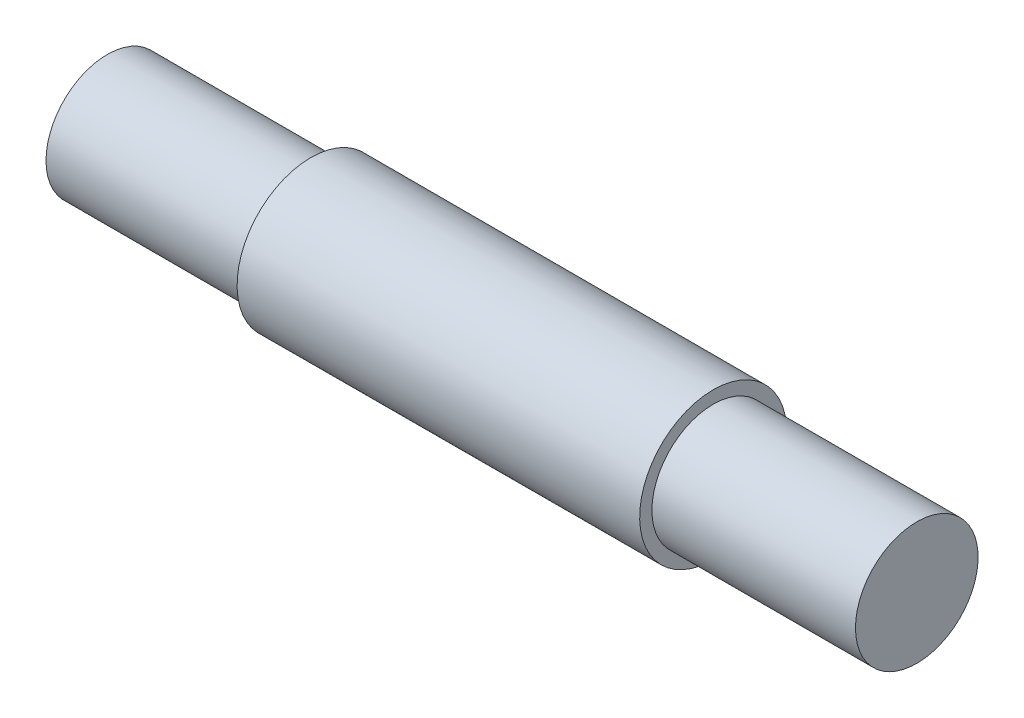
ISO-10303-21;
HEADER;
FILE_DESCRIPTION(('STEP AP214'),'2;1');
FILE_NAME('part.step','',(''),(''),'','','');
FILE_SCHEMA(('AUTOMOTIVE_DESIGN { 1 0 10303 214 1 1 1 1 }'));
ENDSEC;
DATA;
#1=APPLICATION_CONTEXT('core data for automotive mechanical design processes');
#2=APPLICATION_PROTOCOL_DEFINITION('international standard','automotive_design',2000,#1);
#3=PRODUCT_CONTEXT('',#1,'mechanical');
#4=PRODUCT('Part','Part','',(#3));
#5=PRODUCT_RELATED_PRODUCT_CATEGORY('part','',(#4));
#6=PRODUCT_DEFINITION_FORMATION('','',#4);
#7=PRODUCT_DEFINITION_CONTEXT('part definition',#1,'design');
#8=PRODUCT_DEFINITION('design','',#6,#7);
#9=PRODUCT_DEFINITION_SHAPE('','',#8);
#10=(LENGTH_UNIT() NAMED_UNIT(*) SI_UNIT(.MILLI.,.METRE.));
#11=(NAMED_UNIT(*) PLANE_ANGLE_UNIT() SI_UNIT($,.RADIAN.));
#12=(NAMED_UNIT(*) SI_UNIT($,.STERADIAN.) SOLID_ANGLE_UNIT());
#13=UNCERTAINTY_MEASURE_WITH_UNIT(LENGTH_MEASURE(1.E-05),#10,'distance_accuracy_value','');
#14=(GEOMETRIC_REPRESENTATION_CONTEXT(3) GLOBAL_UNCERTAINTY_ASSIGNED_CONTEXT((#13)) GLOBAL_UNIT_ASSIGNED_CONTEXT((#10,
#11,#12)) REPRESENTATION_CONTEXT('',''));
#15=CARTESIAN_POINT('',(0.,0.,0.));
#16=DIRECTION('',(0.,0.,1.));
#17=DIRECTION('',(1.,0.,0.));
#18=AXIS2_PLACEMENT_3D('',#15,#16,#17);
#19=CARTESIAN_POINT('',(-165.,0.,0.));
#20=DIRECTION('',(-1.,0.,0.));
#21=DIRECTION('',(0.,0.,1.));
#22=AXIS2_PLACEMENT_3D('',#19,#20,#21);
#23=CYLINDRICAL_SURFACE('',#22,25.0000000000001);
#24=CARTESIAN_POINT('',(-81.9668927687355,-20.3433340438726,-14.5309586737909));
#25=CARTESIAN_POINT('',(-81.9665946822235,-20.7515901630839,-13.9594090047073));
#26=CARTESIAN_POINT('',(-81.9663142309977,-21.1356931764125,-13.3707087364633));
#27=CARTESIAN_POINT('',(-81.9657904190882,-21.8531003836312,-12.1628697088407));
#28=CARTESIAN_POINT('',(-81.965547068183,-22.1863911851551,-11.5437229814865));
#29=CARTESIAN_POINT('',(-81.9650990529386,-22.799988074823,-10.278872688707));
#30=CARTESIAN_POINT('',(-81.9648944317667,-23.080235041539,-9.63314045597345));
#31=CARTESIAN_POINT('',(-81.9645256722576,-23.5852841144379,-8.32039184013641));
#32=CARTESIAN_POINT('',(-81.9643615312327,-23.8100899014676,-7.65337687335723));
#33=CARTESIAN_POINT('',(-81.9640749494874,-24.2025891838058,-6.30307852014905));
#34=CARTESIAN_POINT('',(-81.9639524899164,-24.3703084965701,-5.61980263773671));
#35=CARTESIAN_POINT('',(-81.9637500370846,-24.6475857190884,-4.24153837972109));
#36=CARTESIAN_POINT('',(-81.9636700444943,-24.7571427103511,-3.54654981933164));
#37=CARTESIAN_POINT('',(-81.9635531124884,-24.9172915277384,-2.14999151356718));
#38=CARTESIAN_POINT('',(-81.963516162105,-24.9678983751292,-1.44842349067625));
#39=CARTESIAN_POINT('',(-81.9634855402824,-25.0098376938008,-0.0435206853568295));
#40=CARTESIAN_POINT('',(-81.9634918686738,-25.0011703969817,0.659814090148775));
#41=CARTESIAN_POINT('',(-81.9635477620209,-24.9246194704131,2.06332860209428));
#42=CARTESIAN_POINT('',(-81.9635973315651,-24.8567295559938,2.76350799576011));
#43=CARTESIAN_POINT('',(-81.9637393611001,-24.6622074325576,4.15565954982598));
#44=CARTESIAN_POINT('',(-81.9638318211342,-24.5355751640176,4.84763170190896));
#45=CARTESIAN_POINT('',(-81.9640589787807,-24.2244624920265,6.21847546285011));
#46=CARTESIAN_POINT('',(-81.964193678037,-24.0399798371248,6.89734656074305));
#47=CARTESIAN_POINT('',(-81.9645043552909,-23.6144796032949,8.23713378849323));
#48=CARTESIAN_POINT('',(-81.9646803332804,-23.373462035432,8.89804992186468));
#49=CARTESIAN_POINT('',(-81.9650723132242,-22.8366105014264,10.1972164061673));
#50=CARTESIAN_POINT('',(-81.9652883144361,-22.5407775520909,10.8354671772719));
#51=CARTESIAN_POINT('',(-81.9657588073368,-21.8963955007615,12.0847782636231));
#52=CARTESIAN_POINT('',(-81.9660132990263,-21.547846397797,12.6958385783691));
#53=CARTESIAN_POINT('',(-81.9665589630347,-20.8005107838025,13.8864232520264));
#54=CARTESIAN_POINT('',(-81.9668501352793,-20.4017243743827,14.465947674719));
#55=CARTESIAN_POINT('',(-81.9674670907413,-19.5567487231352,15.5893418383594));
#56=CARTESIAN_POINT('',(-81.9677928739587,-19.110559481355,16.133211579343));
#57=CARTESIAN_POINT('',(-81.9684767359593,-18.1739493186061,17.1814309002882));
#58=CARTESIAN_POINT('',(-81.9688348148098,-17.6835283052205,17.6857803976729));
#59=CARTESIAN_POINT('',(-81.9695807217617,-16.661942001264,18.6513723447534));
#60=CARTESIAN_POINT('',(-81.9699685498631,-16.1307767107011,19.1126147944577));
#61=CARTESIAN_POINT('',(-81.9707711973582,-15.0314791192235,19.9887126969505));
#62=CARTESIAN_POINT('',(-81.9711860167032,-14.4633468849777,20.4035682333932));
#63=CARTESIAN_POINT('',(-81.9720396981981,-13.2941536201969,21.1839439031275));
#64=CARTESIAN_POINT('',(-81.9724785603478,-12.6930925896961,21.5494640364703));
#65=CARTESIAN_POINT('',(-81.9733772076934,-11.462314517812,22.228570495365));
#66=CARTESIAN_POINT('',(-81.9738369929025,-10.8325974583346,22.5421567881239));
#67=CARTESIAN_POINT('',(-81.9747742173134,-9.54898458680083,23.1151658812731));
#68=CARTESIAN_POINT('',(-81.9752516565152,-8.89508877470856,23.3745886815828));
#69=CARTESIAN_POINT('',(-81.97622079512,-7.56776649741202,23.8374266989243));
#70=CARTESIAN_POINT('',(-81.976712494538,-6.89434001155145,24.0408418567181));
#71=CARTESIAN_POINT('',(-81.9777066574002,-5.53274470988136,24.390218066913));
#72=CARTESIAN_POINT('',(-81.9782091208443,-4.84457589406246,24.5361791192776));
#73=CARTESIAN_POINT('',(-81.9792212394895,-3.45838847441234,24.7696094120487));
#74=CARTESIAN_POINT('',(-81.9797308946898,-2.76036987158979,24.8570786584451));
#75=CARTESIAN_POINT('',(-81.9807537735526,-1.35944530458993,24.9729035100661));
#76=CARTESIAN_POINT('',(-81.9812669972152,-0.656539340415398,25.0012591153244));
#77=CARTESIAN_POINT('',(-81.9822933640812,0.749162423748123,24.9986550942466));
#78=CARTESIAN_POINT('',(-81.9828065072848,1.45195822378155,24.9676954918984));
#79=CARTESIAN_POINT('',(-81.9838290653024,2.85244349014978,24.8466812068532));
#80=CARTESIAN_POINT('',(-81.9843384801164,3.55013295648508,24.7566265241618));
#81=CARTESIAN_POINT('',(-81.9853499598393,4.93544556261455,24.5180622845584));
#82=CARTESIAN_POINT('',(-81.9858520247464,5.62306870010743,24.369552714283));
#83=CARTESIAN_POINT('',(-81.9868452351571,6.98335989710563,24.0151345123943));
#84=CARTESIAN_POINT('',(-81.9873363806607,7.65602795660585,23.8092258807614));
#85=CARTESIAN_POINT('',(-81.9883042605783,8.98162681667661,23.3414734103954));
#86=CARTESIAN_POINT('',(-81.9887809949905,9.63455761466657,23.079629564349));
#87=CARTESIAN_POINT('',(-81.9897166633622,10.9160399103661,22.5018682320611));
#88=CARTESIAN_POINT('',(-81.9901755973218,11.5445914080771,22.1859507458229));
#89=CARTESIAN_POINT('',(-81.9910724019873,12.7728463992842,21.5022881576296));
#90=CARTESIAN_POINT('',(-81.9915102726959,13.3725498963473,21.134543062083));
#91=CARTESIAN_POINT('',(-81.9923618379219,14.5388454336315,20.3498396708643));
#92=CARTESIAN_POINT('',(-81.9927755324393,15.1054374738559,19.9328813751971));
#93=CARTESIAN_POINT('',(-81.9935758041445,16.2014819384111,19.0527159257785));
#94=CARTESIAN_POINT('',(-81.9939623813335,16.7309343644426,18.5895087741448));
#95=CARTESIAN_POINT('',(-81.9947056700699,17.7489355351431,17.6201387207932));
#96=CARTESIAN_POINT('',(-81.9950623816174,18.2374842798201,17.1139758190837));
#97=CARTESIAN_POINT('',(-81.9957434029908,19.1702046924794,16.0622928944369));
#98=CARTESIAN_POINT('',(-81.9960677128237,19.6143763701154,15.5167728800614));
#99=CARTESIAN_POINT('',(-81.9966816252074,20.4551849710287,14.390253951911));
#100=CARTESIAN_POINT('',(-81.9969712277583,20.8518218943105,13.8092550381394));
#101=CARTESIAN_POINT('',(-81.9975136666887,21.5947411476786,12.6159088387879));
#102=CARTESIAN_POINT('',(-81.9977665030667,21.9410234755491,12.0035615518286));
#103=CARTESIAN_POINT('',(-81.9982336121204,22.5807716528249,10.7518720530737));
#104=CARTESIAN_POINT('',(-81.998447884796,22.8742375022349,10.1125298412806));
#105=CARTESIAN_POINT('',(-81.9988363430515,23.4062662943833,8.81139597582269));
#106=CARTESIAN_POINT('',(-81.9990105286401,23.6448292489856,8.14960432700909));
#107=CARTESIAN_POINT('',(-81.9993175744254,24.065356289987,6.8082763997795));
#108=CARTESIAN_POINT('',(-81.9994504346221,24.2473203763976,6.12874012136717));
#109=CARTESIAN_POINT('',(-81.999673885052,24.5533560026719,4.75675412305472));
#110=CARTESIAN_POINT('',(-81.9997644752908,24.677427550163,4.06430440485597));
#111=CARTESIAN_POINT('',(-81.9999027417883,24.8667960580292,2.67141434383509));
#112=CARTESIAN_POINT('',(-81.999950418047,24.9320930184244,1.97097400101569));
#113=CARTESIAN_POINT('',(-82.0000025176263,25.0034481174478,0.567082631063027));
#114=CARTESIAN_POINT('',(-82.0000069409608,25.0095062752762,-0.136368395094363));
#115=CARTESIAN_POINT('',(-81.9999725032809,24.9623407492719,-1.54128024368301));
#116=CARTESIAN_POINT('',(-81.9999336422665,24.9091170654408,-2.24274106611432));
#117=CARTESIAN_POINT('',(-81.9998129121427,24.7437662115574,-3.6386858254493));
#118=CARTESIAN_POINT('',(-81.9997310430159,24.6316390176706,-4.33316975952975));
#119=CARTESIAN_POINT('',(-81.9995248786975,24.3492782881632,-5.7102230874667));
#120=CARTESIAN_POINT('',(-81.999400583506,24.1790447524988,-6.3927924813142));
#121=CARTESIAN_POINT('',(-81.9991104506803,23.7816815419442,-7.74116426510128));
#122=CARTESIAN_POINT('',(-81.9989446130339,23.554551850384,-8.40696665012826));
#123=CARTESIAN_POINT('',(-81.9985725743242,23.0450111127997,-9.71707074887029));
#124=CARTESIAN_POINT('',(-81.9983663732608,22.7626000668071,-10.3613724625975));
#125=CARTESIAN_POINT('',(-81.9979150739226,22.1445047249286,-11.6238939498));
#126=CARTESIAN_POINT('',(-81.9976699756889,21.8088204853171,-12.2421137508255));
#127=CARTESIAN_POINT('',(-81.9971426243529,21.0865650558344,-13.4480769700701));
#128=CARTESIAN_POINT('',(-81.9968603712506,20.6999938660241,-14.0358203883255));
#129=CARTESIAN_POINT('',(-81.9962607168958,19.8787129222993,-15.1766522113588));
#130=CARTESIAN_POINT('',(-81.9959433156516,19.4440031798555,-15.7297406243943));
#131=CARTESIAN_POINT('',(-81.9952756214851,18.5295355778994,-16.7973304735898));
#132=CARTESIAN_POINT('',(-81.9949253285629,18.0497777183297,-17.3118319097006));
#133=CARTESIAN_POINT('',(-81.9941943407465,17.0486237639187,-18.2985909099027));
#134=CARTESIAN_POINT('',(-81.9938136457974,16.5272275939088,-18.7708483977288));
#135=CARTESIAN_POINT('',(-81.9930245609932,15.4465045940822,-19.6697609883183));
#136=CARTESIAN_POINT('',(-81.992616171138,14.887177764248,-20.0964160910607));
#137=CARTESIAN_POINT('',(-81.9917746006326,13.7345708913218,-20.9010899781798));
#138=CARTESIAN_POINT('',(-81.9913414200237,13.1412909047981,-21.2791088435848));
#139=CARTESIAN_POINT('',(-81.9904533470376,11.9249947275807,-21.9838236113011));
#140=CARTESIAN_POINT('',(-81.9899984546604,11.3019785368484,-22.3105195135459));
#141=CARTESIAN_POINT('',(-81.9890701912001,10.0306379251326,-22.9102663585069));
#142=CARTESIAN_POINT('',(-81.9885968200795,9.38231345292285,-23.1833171926338));
#143=CARTESIAN_POINT('',(-81.9876349653983,8.06496668627735,-23.6738318429647));
#144=CARTESIAN_POINT('',(-81.987146481838,7.39594439222004,-23.8912956601851));
#145=CARTESIAN_POINT('',(-81.9861578657865,6.04194557238689,-24.2690938035569));
#146=CARTESIAN_POINT('',(-81.9856577330763,5.35696874664732,-24.4294270546622));
#147=CARTESIAN_POINT('',(-81.9846493832742,3.97594283652343,-24.6918184647741));
#148=CARTESIAN_POINT('',(-81.9841411661807,3.27989374996951,-24.7938766123616));
#149=CARTESIAN_POINT('',(-81.9831202808621,1.88169938261926,-24.9389893450149));
#150=CARTESIAN_POINT('',(-81.982607612811,1.17955434014985,-24.982046226428));
#151=CARTESIAN_POINT('',(-81.9815814511602,-0.225866376079356,-25.0088577388656));
#152=CARTESIAN_POINT('',(-81.9810679575614,-0.929142048692692,-24.9926124299841));
#153=CARTESIAN_POINT('',(-81.980043849187,-2.33175055519465,-24.9009400535933));
#154=CARTESIAN_POINT('',(-81.9795332341116,-3.03108379960076,-24.8255192669994));
#155=CARTESIAN_POINT('',(-81.9785184550873,-4.42091486009894,-24.6160393246941));
#156=CARTESIAN_POINT('',(-81.9780142911637,-5.11141264161287,-24.4819799395691));
#157=CARTESIAN_POINT('',(-81.9770158724603,-6.47883671215227,-24.1561339213657));
#158=CARTESIAN_POINT('',(-81.9765216202396,-7.15575949646483,-23.9643325803549));
#159=CARTESIAN_POINT('',(-81.9755466801491,-8.49102744056545,-23.524382484882));
#160=CARTESIAN_POINT('',(-81.9750659920653,-9.14937289354812,-23.2762346202622));
#161=CARTESIAN_POINT('',(-81.9741213756152,-10.4431098364214,-22.7252286235544));
#162=CARTESIAN_POINT('',(-81.9736574549401,-11.0784907927341,-22.4223457578642));
#163=CARTESIAN_POINT('',(-81.9727498765147,-12.3215007887931,-21.7640819545994));
#164=CARTESIAN_POINT('',(-81.9723062201122,-12.9291279826119,-21.4086975317368));
#165=CARTESIAN_POINT('',(-81.9714428324749,-14.1116146878463,-20.6483855404094));
#166=CARTESIAN_POINT('',(-81.9710230753014,-14.6865097244804,-20.2435132453221));
#167=CARTESIAN_POINT('',(-81.9702100713413,-15.7999914298938,-19.3869453356089));
#168=CARTESIAN_POINT('',(-81.9698168176103,-16.3385876095694,-18.9352620655592));
#169=CARTESIAN_POINT('',(-81.9689651444259,-17.5050302392244,-17.8701717403451));
#170=CARTESIAN_POINT('',(-81.9685148619062,-18.1217324255694,-17.2444911270792));
#171=CARTESIAN_POINT('',(-81.9676648075986,-19.285957812823,-15.9317761588665));
#172=CARTESIAN_POINT('',(-81.9672650358106,-19.8334810137247,-15.2447418039135));
#173=CARTESIAN_POINT('',(-81.9668927687355,-20.3433340438726,-14.5309586737909));
#174=B_SPLINE_CURVE_WITH_KNOTS('',3,(#24,#25,#26,#27,#28,#29,#30,#31,#32,#33,#34,#35,#36,#37,
#38,#39,#40,#41,#42,#43,#44,#45,#46,#47,#48,#49,#50,#51,#52,#53,#54,#55,#56,#57,#58,#59,#60,#61,
#62,#63,#64,#65,#66,#67,#68,#69,#70,#71,#72,#73,#74,#75,#76,#77,#78,#79,#80,#81,#82,#83,#84,#85,
#86,#87,#88,#89,#90,#91,#92,#93,#94,#95,#96,#97,#98,#99,#100,#101,#102,#103,#104,#105,#106,#107,
#108,#109,#110,#111,#112,#113,#114,#115,#116,#117,#118,#119,#120,#121,#122,#123,#124,#125,#126,
#127,#128,#129,#130,#131,#132,#133,#134,#135,#136,#137,#138,#139,#140,#141,#142,#143,#144,#145,
#146,#147,#148,#149,#150,#151,#152,#153,#154,#155,#156,#157,#158,#159,#160,#161,#162,#163,#164,
#165,#166,#167,#168,#169,#170,#171,#172,#173),.UNSPECIFIED.,.T.,.F.,(4,2,2,2,2,2,2,2,2,2,2,2,2,
2,2,2,2,2,2,2,2,2,2,2,2,2,2,2,2,2,2,2,2,2,2,2,2,2,2,2,2,2,2,2,2,2,2,2,2,2,2,2,2,2,2,2,2,2,2,2,2,
2,2,2,2,2,2,2,2,2,2,2,2,2,4),(0.,2.10638341256655,4.2133210397439,6.32259335760769,
8.43172559909458,10.5399027105492,12.6481131130529,14.755786198434,16.8634510379038,
18.9713395687554,21.0792302355184,23.1872029484239,25.295175248747,27.4031084507915,
29.5110416916519,31.6189706690632,33.7268996443603,35.8348330240281,37.942766403287,
40.0506959810436,42.1586255566119,44.2665564631964,46.3744873729132,48.4824205121318,
50.5903536526918,52.6982865773895,54.8062195008859,56.9141515719007,59.0220836427082,
61.1300161954061,63.2379487488219,65.3458815778419,67.4538144067343,69.561746974979,
71.6696795430141,73.7776120145254,75.8855444856274,77.9934764981698,80.1014085105095,
82.2093406156025,84.317272720511,86.4252043699163,88.5331360188876,90.6410673901357,
92.7489987606628,94.8569294479753,96.96486013523,99.0727916754303,101.180723217221,
103.28865537661,105.396587534805,107.504517466336,109.612447395345,111.720376822069,
113.828306251477,115.936239486362,118.044172722221,120.152102446208,122.260032172936,
124.367966166532,126.475900121584,128.583873740284,130.691847772045,132.799739758482,
134.907629608884,137.015295757042,139.122970151165,141.231181863405,143.339360284404,
145.448493740139,147.557767272549,149.664706106972,151.771090725172,154.401659906886,
157.032229088862),.UNSPECIFIED.);
#175=CARTESIAN_POINT('',(-81.9668927687355,-20.3433340438726,-14.5309586737909));
#176=VERTEX_POINT('',#175);
#177=EDGE_CURVE('E35',#176,#176,#174,.T.);
#178=ORIENTED_EDGE('',*,*,#177,.T.);
#179=EDGE_LOOP('',(#178));
#180=FACE_BOUND('',#179,.T.);
#181=CARTESIAN_POINT('',(-165.,0.,0.));
#182=DIRECTION('',(-1.,0.,0.));
#183=DIRECTION('',(0.,0.,1.));
#184=AXIS2_PLACEMENT_3D('',#181,#182,#183);
#185=CIRCLE('',#184,25.);
#186=CARTESIAN_POINT('',(-165.,0.,25.));
#187=VERTEX_POINT('',#186);
#188=EDGE_CURVE('E10',#187,#187,#185,.T.);
#189=ORIENTED_EDGE('',*,*,#188,.F.);
#190=EDGE_LOOP('',(#189));
#191=FACE_BOUND('',#190,.T.);
#192=ADVANCED_FACE('F31',(#180,#191),#23,.T.);
#193=CARTESIAN_POINT('',(-165.,0.,0.));
#194=DIRECTION('',(1.,0.,0.));
#195=DIRECTION('',(0.,0.,-1.));
#196=AXIS2_PLACEMENT_3D('',#193,#194,#195);
#197=PLANE('',#196);
#198=ORIENTED_EDGE('',*,*,#188,.T.);
#199=EDGE_LOOP('',(#198));
#200=FACE_BOUND('',#199,.T.);
#201=ADVANCED_FACE('F33',(#200),#197,.F.);
#202=CARTESIAN_POINT('',(-81.978008226985,1.60571863218616E-05,0.));
#203=DIRECTION('',(0.99999973344414,0.000730144951438481,0.));
#204=DIRECTION('',(-0.000730144951438481,0.99999973344414,0.));
#205=AXIS2_PLACEMENT_3D('',#202,#203,#204);
#206=CONICAL_SURFACE('',#205,30.1197357753601,1.57006618177858);
#207=CARTESIAN_POINT('',(-81.978008226985,1.60571863218616E-05,0.));
#208=DIRECTION('',(0.99999973344414,0.000730144951438481,0.));
#209=DIRECTION('',(-0.000730144951438481,0.99999973344414,0.));
#210=AXIS2_PLACEMENT_3D('',#207,#208,#209);
#211=CIRCLE('',#210,30.1197357753601);
#212=CARTESIAN_POINT('',(-82.,30.1197438039543,0.));
#213=VERTEX_POINT('',#212);
#214=EDGE_CURVE('E56',#213,#213,#211,.T.);
#215=ORIENTED_EDGE('',*,*,#214,.F.);
#216=EDGE_LOOP('',(#215));
#217=FACE_BOUND('',#216,.T.);
#218=ORIENTED_EDGE('',*,*,#177,.F.);
#219=EDGE_LOOP('',(#218));
#220=FACE_BOUND('',#219,.T.);
#221=ADVANCED_FACE('F65',(#217,#220),#206,.T.);
#222=CARTESIAN_POINT('',(82.,0.119743803954325,0.));
#223=DIRECTION('',(0.99999973344414,0.000730144951438481,0.));
#224=DIRECTION('',(-0.000730144951438481,0.99999973344414,0.));
#225=AXIS2_PLACEMENT_3D('',#222,#223,#224);
#226=CONICAL_SURFACE('',#225,0.,1.57006618177858);
#227=CARTESIAN_POINT('',(82.0219043427044,0.119759797303829,0.));
#228=DIRECTION('',(0.99999973344414,0.000730144951438481,0.));
#229=DIRECTION('',(-0.000730144951438481,0.99999973344414,0.));
#230=AXIS2_PLACEMENT_3D('',#227,#228,#229);
#231=CIRCLE('',#230,29.9999920033242);
#232=CARTESIAN_POINT('',(82.,30.1197438039543,0.));
#233=VERTEX_POINT('',#232);
#234=EDGE_CURVE('E132',#233,#233,#231,.T.);
#235=ORIENTED_EDGE('',*,*,#234,.T.);
#236=EDGE_LOOP('',(#235));
#237=FACE_BOUND('',#236,.T.);
#238=CARTESIAN_POINT('',(82.0332658771211,-20.3433339708878,-14.5309587759697));
#239=CARTESIAN_POINT('',(82.0329663743579,-19.9350859753492,-15.1025144062797));
#240=CARTESIAN_POINT('',(82.0326492225286,-19.5027810065479,-15.6567848331689));
#241=CARTESIAN_POINT('',(82.0319817081693,-18.5929026302079,-16.727144641476));
#242=CARTESIAN_POINT('',(82.031631336923,-18.1153173418897,-17.2432239385995));
#243=CARTESIAN_POINT('',(82.030899557283,-17.1178412272408,-18.2338748428659));
#244=CARTESIAN_POINT('',(82.0305181149271,-16.59790410854,-18.7083998216267));
#245=CARTESIAN_POINT('',(82.0297272667145,-15.5199141327131,-19.6119048669603));
#246=CARTESIAN_POINT('',(82.0293178627166,-14.9618638091453,-20.0408879560768));
#247=CARTESIAN_POINT('',(82.0284741751483,-13.8118512250194,-20.8501052237061));
#248=CARTESIAN_POINT('',(82.0280399029276,-13.2199044346647,-21.2303613884222));
#249=CARTESIAN_POINT('',(82.0271493909116,-12.0060683474161,-21.9396547940834));
#250=CARTESIAN_POINT('',(82.0266931507695,-11.3841785778353,-22.2686912261143));
#251=CARTESIAN_POINT('',(82.0257620725859,-10.1150497925556,-22.8731206505647));
#252=CARTESIAN_POINT('',(82.0252872393142,-9.46781727798359,-23.1485272936456));
#253=CARTESIAN_POINT('',(82.0243222423253,-8.15245690233071,-23.6438432149168));
#254=CARTESIAN_POINT('',(82.0238320786683,-7.48432912300341,-23.8637527102116));
#255=CARTESIAN_POINT('',(82.0228398500845,-6.13185252732556,-24.2465330639435));
#256=CARTESIAN_POINT('',(82.0223377838955,-5.44750199057149,-24.4093978437053));
#257=CARTESIAN_POINT('',(82.0213253693061,-4.06751298069503,-24.6768985137976));
#258=CARTESIAN_POINT('',(82.0208150208973,-3.37187449613222,-24.7815343451087));
#259=CARTESIAN_POINT('',(82.0197896504639,-1.97422839493855,-24.9318359276745));
#260=CARTESIAN_POINT('',(82.0192746282582,-1.27222053144446,-24.9774993833719));
#261=CARTESIAN_POINT('',(82.0182435915774,0.133146396095968,-25.0095240338531));
#262=CARTESIAN_POINT('',(82.0177275771026,0.836505459877821,-24.9958852402439));
#263=CARTESIAN_POINT('',(82.0166982339708,2.23956133664307,-24.9094031875723));
#264=CARTESIAN_POINT('',(82.0161849052646,2.93925821687001,-24.8365610194439));
#265=CARTESIAN_POINT('',(82.0151645735586,4.33002837962428,-24.6321914651099));
#266=CARTESIAN_POINT('',(82.014657570559,5.02110166199163,-24.5006640778156));
#267=CARTESIAN_POINT('',(82.0136534958348,6.38971009874378,-24.1798594912781));
#268=CARTESIAN_POINT('',(82.0131564240902,7.06724528051225,-23.9905824088584));
#269=CARTESIAN_POINT('',(82.0121757447578,8.40396209631098,-23.5556239834853));
#270=CARTESIAN_POINT('',(82.0116921371699,9.06314373036355,-23.3099426406004));
#271=CARTESIAN_POINT('',(82.0107418234886,10.358468294328,-22.7639218203104));
#272=CARTESIAN_POINT('',(82.0102751174269,10.9946111808114,-22.46358223988));
#273=CARTESIAN_POINT('',(82.0093619258608,12.2393343354923,-21.8103804893072));
#274=CARTESIAN_POINT('',(82.0089154403564,12.8479146036974,-21.457518319179));
#275=CARTESIAN_POINT('',(82.0080458650492,14.0331847993818,-20.7017807129657));
#276=CARTESIAN_POINT('',(82.0076227752042,14.6098747844195,-20.298905367153));
#277=CARTESIAN_POINT('',(82.0068029983744,15.727265682251,-19.446005103315));
#278=CARTESIAN_POINT('',(82.0064063113897,16.2679665950939,-18.9959801853541));
#279=CARTESIAN_POINT('',(82.0056421605338,17.309535391031,-18.0519800874031));
#280=CARTESIAN_POINT('',(82.0052746966682,17.8104032665379,-17.5580048990416));
#281=CARTESIAN_POINT('',(82.004571604706,18.7687450030378,-16.5296161953149));
#282=CARTESIAN_POINT('',(82.0042359766093,19.2262188639775,-15.9952026799));
#283=CARTESIAN_POINT('',(82.0035989420868,20.0945206632228,-14.8897360934583));
#284=CARTESIAN_POINT('',(82.0032975356969,20.5053485522887,-14.3186829837556));
#285=CARTESIAN_POINT('',(82.0027310879391,21.277437102397,-13.1439975652115));
#286=CARTESIAN_POINT('',(82.002466046571,21.6386977634226,-12.5403652563592));
#287=CARTESIAN_POINT('',(82.0019742134014,22.3090833061254,-11.3048132722889));
#288=CARTESIAN_POINT('',(82.0017474215774,22.6182082183815,-10.6728936136626));
#289=CARTESIAN_POINT('',(82.0013336997621,23.1821248239202,-9.38525917302919));
#290=CARTESIAN_POINT('',(82.0011467697708,23.4369165172516,-8.72954439104347));
#291=CARTESIAN_POINT('',(82.0008141007355,23.8903551727113,-7.39898171596522));
#292=CARTESIAN_POINT('',(82.0006683616748,24.0890021576427,-6.72413383064372));
#293=CARTESIAN_POINT('',(82.0004191105861,24.4287392708242,-5.36010245802773));
#294=CARTESIAN_POINT('',(82.0003155985581,24.569829399088,-4.67091897073668));
#295=CARTESIAN_POINT('',(82.0001515375006,24.7934497212699,-3.28311613640629));
#296=CARTESIAN_POINT('',(82.0000909884673,24.8759799202539,-2.58449679018325));
#297=CARTESIAN_POINT('',(82.0000132838818,24.9818936624927,-1.18278894451735));
#298=CARTESIAN_POINT('',(81.9999961283295,25.0052772057423,-0.479700445074108));
#299=CARTESIAN_POINT('',(82.0000053326808,24.9927313924006,0.925947260238408));
#300=CARTESIAN_POINT('',(82.00003169259,24.9568020280913,1.62850646603879));
#301=CARTESIAN_POINT('',(82.0001277404587,24.8258858217409,3.02810071582544));
#302=CARTESIAN_POINT('',(82.0001974284181,24.7308989796986,3.7251357598116));
#303=CARTESIAN_POINT('',(82.0003796369015,24.4825431350733,5.10872609195056));
#304=CARTESIAN_POINT('',(82.0004921574198,24.3291741401765,5.79528138148306));
#305=CARTESIAN_POINT('',(82.0007592310137,23.9651443522087,7.15303130226365));
#306=CARTESIAN_POINT('',(82.0009137840893,23.7544835591472,7.8242259335143));
#307=CARTESIAN_POINT('',(82.0012638239378,23.2773678596997,9.14648271743862));
#308=CARTESIAN_POINT('',(82.0014593107088,23.0109129558263,9.79754487101892));
#309=CARTESIAN_POINT('',(82.0018898280695,22.4241033658677,11.0749080717336));
#310=CARTESIAN_POINT('',(82.0021248586593,22.1037486797787,11.7012091188662));
#311=CARTESIAN_POINT('',(82.0026327926504,21.4114170278714,12.9245975366685));
#312=CARTESIAN_POINT('',(82.0029056960549,21.0394400576609,13.5216849048526));
#313=CARTESIAN_POINT('',(82.0034874353674,20.2465083938461,14.6824009775072));
#314=CARTESIAN_POINT('',(82.0037962712755,19.8255537002393,15.2460296819759));
#315=CARTESIAN_POINT('',(82.0044476798518,18.9376593067079,16.3358213938883));
#316=CARTESIAN_POINT('',(82.0047902525216,18.4707196046767,16.8619843996156));
#317=CARTESIAN_POINT('',(82.0055066989991,17.4941748732957,17.8731039864578));
#318=CARTESIAN_POINT('',(82.0058805728068,16.9845698439352,18.3580605675625));
#319=CARTESIAN_POINT('',(82.0066569635204,15.9263173048058,19.2833196818765));
#320=CARTESIAN_POINT('',(82.0070594804339,15.3776697847092,19.7236222032736));
#321=CARTESIAN_POINT('',(82.0078902954958,14.2452329402534,20.5564427687126));
#322=CARTESIAN_POINT('',(82.0083185936442,13.6614436158911,20.9489608127501));
#323=CARTESIAN_POINT('',(82.0091979260613,12.4628736336573,21.6834218117875));
#324=CARTESIAN_POINT('',(82.0096489603269,11.848092979805,22.0253647733462));
#325=CARTESIAN_POINT('',(82.0105705583432,10.5919109894749,22.6562446634089));
#326=CARTESIAN_POINT('',(82.0110411220937,9.95050965299938,22.9451815919173));
#327=CARTESIAN_POINT('',(82.011998433623,8.64564619304603,23.4679952843709));
#328=CARTESIAN_POINT('',(82.0124851814038,7.98218406683583,23.7018720414965));
#329=CARTESIAN_POINT('',(82.0134714003786,6.63791591854444,24.1129026251011));
#330=CARTESIAN_POINT('',(82.0139708715727,5.95710989645822,24.2900564515637));
#331=CARTESIAN_POINT('',(82.0149789865813,4.58299379688231,24.5863817792818));
#332=CARTESIAN_POINT('',(82.0154876303997,3.88968371431539,24.7055532569932));
#333=CARTESIAN_POINT('',(82.016510474267,2.49548878195915,24.8850665434574));
#334=CARTESIAN_POINT('',(82.0170246743159,1.7946039321636,24.9454083521617));
#335=CARTESIAN_POINT('',(82.0180549752339,0.390241977087462,25.0068333227906));
#336=CARTESIAN_POINT('',(82.0185710761041,-0.313235129520131,25.0079164543757));
#337=CARTESIAN_POINT('',(82.0196015092317,-1.71777993530199,24.9508162938285));
#338=CARTESIAN_POINT('',(82.0201158414893,-2.41884763447715,24.8926330017182));
#339=CARTESIAN_POINT('',(82.0211390802745,-3.81358871205951,24.7174137346676));
#340=CARTESIAN_POINT('',(82.021647986808,-4.50726209827566,24.6003778218864));
#341=CARTESIAN_POINT('',(82.0226567567215,-5.88228370521372,24.3082853984187));
#342=CARTESIAN_POINT('',(82.0231566201016,-6.56363192595227,24.1332288878106));
#343=CARTESIAN_POINT('',(82.0241437498732,-7.90915899783294,23.7263398824617));
#344=CARTESIAN_POINT('',(82.024631016269,-8.57333785488534,23.4945074072655));
#345=CARTESIAN_POINT('',(82.0255894881613,-9.87980453694323,22.9757146264942));
#346=CARTESIAN_POINT('',(82.0260606936577,-10.522092361921,22.6887543208494));
#347=CARTESIAN_POINT('',(82.0269836946914,-11.7802118393707,22.0617454228748));
#348=CARTESIAN_POINT('',(82.0274354901937,-12.3960434441102,21.7216967347676));
#349=CARTESIAN_POINT('',(82.0283164584362,-13.5968710448189,20.9909289907862));
#350=CARTESIAN_POINT('',(82.0287456311764,-14.1818670407834,20.600209934904));
#351=CARTESIAN_POINT('',(82.029578301984,-15.3168632767479,19.7708800882002));
#352=CARTESIAN_POINT('',(82.0299818001041,-15.8668635885038,19.3322693955817));
#353=CARTESIAN_POINT('',(82.0307602541239,-16.9279595963448,18.4102738715929));
#354=CARTESIAN_POINT('',(82.0311352100237,-17.4390552923875,17.9268890401738));
#355=CARTESIAN_POINT('',(82.0318539147423,-18.4187094786476,16.9187807858625));
#356=CARTESIAN_POINT('',(82.032197663498,-18.8872678828443,16.3940572793775));
#357=CARTESIAN_POINT('',(82.0328515093319,-19.778515130065,15.3070030183261));
#358=CARTESIAN_POINT('',(82.0331616064106,-20.2012039739426,14.7446722644595));
#359=CARTESIAN_POINT('',(82.0337459497606,-20.9977143390724,13.5863907201463));
#360=CARTESIAN_POINT('',(82.0340201953749,-21.3715349648413,12.990439313906));
#361=CARTESIAN_POINT('',(82.0345308794817,-22.0676421181167,11.7691627498477));
#362=CARTESIAN_POINT('',(82.0347673179667,-22.3899286355414,11.1438375862831));
#363=CARTESIAN_POINT('',(82.0352006984018,-22.9806646180237,9.86828433941296));
#364=CARTESIAN_POINT('',(82.0353976418888,-23.2491161781117,9.21805722635993));
#365=CARTESIAN_POINT('',(82.0357506436598,-23.7302892510126,7.89730036633997));
#366=CARTESIAN_POINT('',(82.0359067019853,-23.9430108203106,7.22677063995152));
#367=CARTESIAN_POINT('',(82.0361768099228,-24.311192370414,5.87024712875766));
#368=CARTESIAN_POINT('',(82.0362908640077,-24.4666584479602,5.1842549986965));
#369=CARTESIAN_POINT('',(82.0364761765921,-24.7192563655928,3.8016107889692));
#370=CARTESIAN_POINT('',(82.0365474349243,-24.8163879774687,3.10495866761098));
#371=CARTESIAN_POINT('',(82.0366466614663,-24.9516428191854,1.70577003550669));
#372=CARTESIAN_POINT('',(82.0366746186353,-24.9897509995248,1.00323206991112));
#373=CARTESIAN_POINT('',(82.0366870093102,-25.0066406232088,-0.40254520777775));
#374=CARTESIAN_POINT('',(82.0366714435035,-24.9854230033855,-1.10578450862075));
#375=CARTESIAN_POINT('',(82.0365968830858,-24.8837903378668,-2.50829363400126));
#376=CARTESIAN_POINT('',(82.036537868809,-24.8033484858408,-3.20756151650251));
#377=CARTESIAN_POINT('',(82.0363768050434,-24.5838038958456,-4.596871815419));
#378=CARTESIAN_POINT('',(82.0362747526969,-24.4446972623143,-5.28691361604775));
#379=CARTESIAN_POINT('',(82.0360284699686,-24.1089915832912,-6.65206876066571));
#380=CARTESIAN_POINT('',(82.0358842863977,-23.9124563449905,-7.32719778313509));
#381=CARTESIAN_POINT('',(82.0355547861967,-23.4633179414422,-8.65829597625617));
#382=CARTESIAN_POINT('',(82.0353694803963,-23.2107295380807,-9.31427014006349));
#383=CARTESIAN_POINT('',(82.0349078726179,-22.5815170459675,-10.7630947095679));
#384=CARTESIAN_POINT('',(82.0346204015532,-22.1896685551826,-11.5493838702719));
#385=CARTESIAN_POINT('',(82.0339864214065,-21.3254980748838,-13.0764211553018));
#386=CARTESIAN_POINT('',(82.0336399123245,-20.8531760853906,-13.8171692796393));
#387=CARTESIAN_POINT('',(82.0332658771211,-20.3433339708878,-14.5309587759697));
#388=B_SPLINE_CURVE_WITH_KNOTS('',3,(#238,#239,#240,#241,#242,#243,#244,#245,#246,#247,#248,
#249,#250,#251,#252,#253,#254,#255,#256,#257,#258,#259,#260,#261,#262,#263,#264,#265,#266,#267,
#268,#269,#270,#271,#272,#273,#274,#275,#276,#277,#278,#279,#280,#281,#282,#283,#284,#285,#286,
#287,#288,#289,#290,#291,#292,#293,#294,#295,#296,#297,#298,#299,#300,#301,#302,#303,#304,#305,
#306,#307,#308,#309,#310,#311,#312,#313,#314,#315,#316,#317,#318,#319,#320,#321,#322,#323,#324,
#325,#326,#327,#328,#329,#330,#331,#332,#333,#334,#335,#336,#337,#338,#339,#340,#341,#342,#343,
#344,#345,#346,#347,#348,#349,#350,#351,#352,#353,#354,#355,#356,#357,#358,#359,#360,#361,#362,
#363,#364,#365,#366,#367,#368,#369,#370,#371,#372,#373,#374,#375,#376,#377,#378,#379,#380,#381,
#382,#383,#384,#385,#386,#387),.UNSPECIFIED.,.T.,.F.,(4,2,2,2,2,2,2,2,2,2,2,2,2,2,2,2,2,2,2,2,2,
2,2,2,2,2,2,2,2,2,2,2,2,2,2,2,2,2,2,2,2,2,2,2,2,2,2,2,2,2,2,2,2,2,2,2,2,2,2,2,2,2,2,2,2,2,2,2,2,
2,2,2,2,2,4),(0.,2.10638380220094,4.21332182101778,6.322594539053,8.4317271803419,
10.5399047780266,12.6481156668225,14.755789238605,16.8634545650628,18.9713444157047,
21.0792364028421,23.1872104392588,25.2951840630947,27.4031188444167,29.5110536648449,
31.6189842210996,33.726914774794,35.8348493017701,37.9427838281773,40.0507145498756,
42.1586452686946,44.2665763890242,46.3745075119433,48.4824408599861,50.5903742087377,
52.6983063211241,54.8062384316217,56.9141696859816,59.0221009398371,61.1300320113384,
63.2379630830263,65.3458944290043,67.4538257750234,69.5617568435256,71.6696879116764,
73.7776188849004,75.8855498582759,77.9934810109989,80.1014121638288,82.2093434132224,
84.3172746631383,86.4252064706596,88.5331382783722,90.641069812715,92.7490013468797,
94.8569331421241,96.9648649379776,99.072797589766,101.180730243286,103.288663976035,
105.396597708006,107.504529213623,109.612460716396,111.720391493537,113.828322273345,
115.936256856139,118.044191439262,120.152121700087,122.26005196321,124.367986488983,
126.475920975527,128.583894083395,130.691867603651,132.799759074505,134.907648408899,
137.015313223811,139.122986284077,141.231196659934,143.339373744575,145.448505628621,
147.557777589014,149.664714854548,151.771097904536,154.401663599116,157.03222929302),.UNSPECIFIED.);
#389=CARTESIAN_POINT('',(82.0332658771211,-20.3433339708878,-14.5309587759697));
#390=VERTEX_POINT('',#389);
#391=EDGE_CURVE('E50',#390,#390,#388,.T.);
#392=ORIENTED_EDGE('',*,*,#391,.F.);
#393=EDGE_LOOP('',(#392));
#394=FACE_BOUND('',#393,.T.);
#395=ADVANCED_FACE('F60',(#237,#394),#226,.F.);
#396=CARTESIAN_POINT('',(82.0219043427044,0.119759797303829,0.));
#397=DIRECTION('',(-0.99999973344414,-0.000730144951438481,0.));
#398=DIRECTION('',(0.000730144951438481,-0.99999973344414,0.));
#399=AXIS2_PLACEMENT_3D('',#396,#397,#398);
#400=CONICAL_SURFACE('',#399,29.9999920033242,0.000730145016313305);
#401=ORIENTED_EDGE('',*,*,#214,.T.);
#402=EDGE_LOOP('',(#401));
#403=FACE_BOUND('',#402,.T.);
#404=ORIENTED_EDGE('',*,*,#234,.F.);
#405=EDGE_LOOP('',(#404));
#406=FACE_BOUND('',#405,.T.);
#407=ADVANCED_FACE('F64',(#403,#406),#400,.T.);
#408=CARTESIAN_POINT('',(165.,25.0000000000002,0.));
#409=DIRECTION('',(-1.,0.,0.));
#410=DIRECTION('',(0.,0.,1.));
#411=AXIS2_PLACEMENT_3D('',#408,#409,#410);
#412=PLANE('',#411);
#413=CARTESIAN_POINT('',(165.,0.,0.));
#414=DIRECTION('',(-1.,0.,0.));
#415=DIRECTION('',(0.,0.,1.));
#416=AXIS2_PLACEMENT_3D('',#413,#414,#415);
#417=CIRCLE('',#416,25.0000000000002);
#418=CARTESIAN_POINT('',(165.,0.,25.0000000000002));
#419=VERTEX_POINT('',#418);
#420=EDGE_CURVE('E43',#419,#419,#417,.T.);
#421=ORIENTED_EDGE('',*,*,#420,.F.);
#422=EDGE_LOOP('',(#421));
#423=FACE_BOUND('',#422,.T.);
#424=ADVANCED_FACE('F68',(#423),#412,.F.);
#425=ORIENTED_EDGE('',*,*,#391,.T.);
#426=EDGE_LOOP('',(#425));
#427=FACE_BOUND('',#426,.T.);
#428=ORIENTED_EDGE('',*,*,#420,.T.);
#429=EDGE_LOOP('',(#428));
#430=FACE_BOUND('',#429,.T.);
#431=ADVANCED_FACE('F57',(#427,#430),#23,.T.);
#432=CLOSED_SHELL('',(#192,#201,#221,#395,#407,#424,#431));
#433=MANIFOLD_SOLID_BREP('B2',#432);
#434=ADVANCED_BREP_SHAPE_REPRESENTATION('',(#18,#433),#14);
#435=SHAPE_DEFINITION_REPRESENTATION(#9,#434);
ENDSEC;
END-ISO-10303-21;
